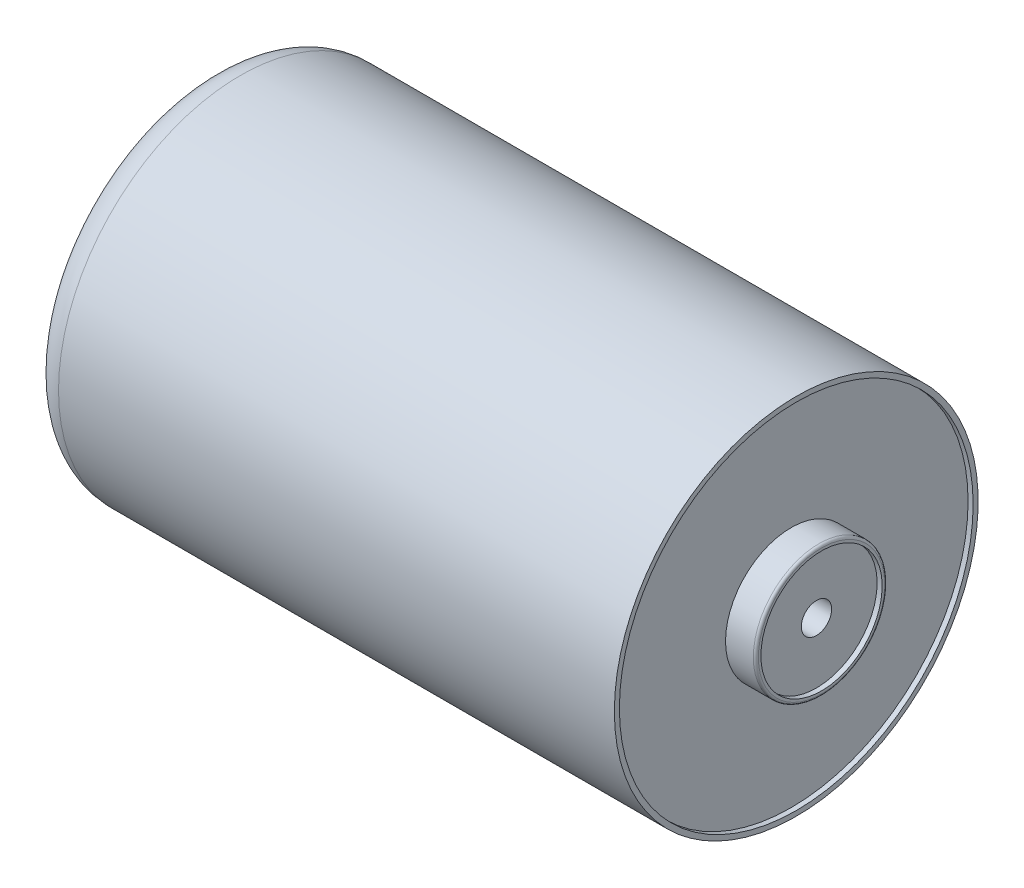
ISO-10303-21;
HEADER;
FILE_DESCRIPTION(('STEP AP214'),'2;1');
FILE_NAME('part.step','',(''),(''),'','','');
FILE_SCHEMA(('AUTOMOTIVE_DESIGN { 1 0 10303 214 1 1 1 1 }'));
ENDSEC;
DATA;
#1=APPLICATION_CONTEXT('core data for automotive mechanical design processes');
#2=APPLICATION_PROTOCOL_DEFINITION('international standard','automotive_design',2000,#1);
#3=PRODUCT_CONTEXT('',#1,'mechanical');
#4=PRODUCT('Part','Part','',(#3));
#5=PRODUCT_RELATED_PRODUCT_CATEGORY('part','',(#4));
#6=PRODUCT_DEFINITION_FORMATION('','',#4);
#7=PRODUCT_DEFINITION_CONTEXT('part definition',#1,'design');
#8=PRODUCT_DEFINITION('design','',#6,#7);
#9=PRODUCT_DEFINITION_SHAPE('','',#8);
#10=(LENGTH_UNIT() NAMED_UNIT(*) SI_UNIT(.MILLI.,.METRE.));
#11=(NAMED_UNIT(*) PLANE_ANGLE_UNIT() SI_UNIT($,.RADIAN.));
#12=(NAMED_UNIT(*) SI_UNIT($,.STERADIAN.) SOLID_ANGLE_UNIT());
#13=UNCERTAINTY_MEASURE_WITH_UNIT(LENGTH_MEASURE(1.E-05),#10,'distance_accuracy_value','');
#14=(GEOMETRIC_REPRESENTATION_CONTEXT(3) GLOBAL_UNCERTAINTY_ASSIGNED_CONTEXT((#13)) GLOBAL_UNIT_ASSIGNED_CONTEXT((#10,
#11,#12)) REPRESENTATION_CONTEXT('',''));
#15=CARTESIAN_POINT('',(0.,0.,0.));
#16=DIRECTION('',(0.,0.,1.));
#17=DIRECTION('',(1.,0.,0.));
#18=AXIS2_PLACEMENT_3D('',#15,#16,#17);
#19=CARTESIAN_POINT('',(0.,0.,0.));
#20=DIRECTION('',(-1.,0.,0.));
#21=DIRECTION('',(0.,0.,1.));
#22=AXIS2_PLACEMENT_3D('',#19,#20,#21);
#23=CYLINDRICAL_SURFACE('',#22,1.49999999999999);
#24=CARTESIAN_POINT('',(70.4735008103728,0.,0.));
#25=DIRECTION('',(-1.,0.,0.));
#26=DIRECTION('',(0.,0.,1.));
#27=AXIS2_PLACEMENT_3D('',#24,#25,#26);
#28=CIRCLE('',#27,1.5);
#29=CARTESIAN_POINT('',(70.4735008103728,0.,1.5));
#30=VERTEX_POINT('',#29);
#31=EDGE_CURVE('E93',#30,#30,#28,.T.);
#32=ORIENTED_EDGE('',*,*,#31,.F.);
#33=EDGE_LOOP('',(#32));
#34=FACE_BOUND('',#33,.T.);
#35=CARTESIAN_POINT('',(6.47350081037276,0.,0.));
#36=DIRECTION('',(-1.,0.,0.));
#37=DIRECTION('',(0.,0.,1.));
#38=AXIS2_PLACEMENT_3D('',#35,#36,#37);
#39=CIRCLE('',#38,1.49999999999999);
#40=CARTESIAN_POINT('',(6.47350081037276,0.,1.49999999999999));
#41=VERTEX_POINT('',#40);
#42=EDGE_CURVE('E66',#41,#41,#39,.T.);
#43=ORIENTED_EDGE('',*,*,#42,.T.);
#44=EDGE_LOOP('',(#43));
#45=FACE_BOUND('',#44,.T.);
#46=ADVANCED_FACE('F35',(#34,#45),#23,.F.);
#47=CARTESIAN_POINT('',(6.47350081037276,1.49999999999999,0.));
#48=DIRECTION('',(1.,0.,0.));
#49=DIRECTION('',(0.,0.,-1.));
#50=AXIS2_PLACEMENT_3D('',#47,#48,#49);
#51=PLANE('',#50);
#52=ORIENTED_EDGE('',*,*,#42,.F.);
#53=EDGE_LOOP('',(#52));
#54=FACE_BOUND('',#53,.T.);
#55=CARTESIAN_POINT('',(6.47350081037276,0.,0.));
#56=DIRECTION('',(-1.,0.,0.));
#57=DIRECTION('',(0.,0.,1.));
#58=AXIS2_PLACEMENT_3D('',#55,#56,#57);
#59=CIRCLE('',#58,6.);
#60=CARTESIAN_POINT('',(6.47350081037276,0.,6.));
#61=VERTEX_POINT('',#60);
#62=EDGE_CURVE('E69',#61,#61,#59,.T.);
#63=ORIENTED_EDGE('',*,*,#62,.T.);
#64=EDGE_LOOP('',(#63));
#65=FACE_BOUND('',#64,.T.);
#66=ADVANCED_FACE('F148',(#54,#65),#51,.F.);
#67=CARTESIAN_POINT('',(0.,0.,0.));
#68=DIRECTION('',(-1.,0.,0.));
#69=DIRECTION('',(0.,0.,1.));
#70=AXIS2_PLACEMENT_3D('',#67,#68,#69);
#71=CYLINDRICAL_SURFACE('',#70,6.);
#72=ORIENTED_EDGE('',*,*,#62,.F.);
#73=EDGE_LOOP('',(#72));
#74=FACE_BOUND('',#73,.T.);
#75=CARTESIAN_POINT('',(5.97350081037276,0.,0.));
#76=DIRECTION('',(-1.,0.,0.));
#77=DIRECTION('',(0.,0.,1.));
#78=AXIS2_PLACEMENT_3D('',#75,#76,#77);
#79=CIRCLE('',#78,6.);
#80=CARTESIAN_POINT('',(5.97350081037276,0.,6.));
#81=VERTEX_POINT('',#80);
#82=EDGE_CURVE('E72',#81,#81,#79,.T.);
#83=ORIENTED_EDGE('',*,*,#82,.T.);
#84=EDGE_LOOP('',(#83));
#85=FACE_BOUND('',#84,.T.);
#86=ADVANCED_FACE('F143',(#74,#85),#71,.F.);
#87=CARTESIAN_POINT('',(5.97350081037276,6.,0.));
#88=DIRECTION('',(1.,0.,0.));
#89=DIRECTION('',(0.,0.,-1.));
#90=AXIS2_PLACEMENT_3D('',#87,#88,#89);
#91=PLANE('',#90);
#92=CARTESIAN_POINT('',(5.97350081037276,0.,0.));
#93=DIRECTION('',(1.,0.,0.));
#94=DIRECTION('',(0.,0.,-1.));
#95=AXIS2_PLACEMENT_3D('',#92,#93,#94);
#96=CIRCLE('',#95,6.25);
#97=CARTESIAN_POINT('',(5.97350081037276,0.,-6.25));
#98=VERTEX_POINT('',#97);
#99=EDGE_CURVE('E45',#98,#98,#96,.F.);
#100=ORIENTED_EDGE('',*,*,#99,.T.);
#101=EDGE_LOOP('',(#100));
#102=FACE_BOUND('',#101,.T.);
#103=ORIENTED_EDGE('',*,*,#82,.F.);
#104=EDGE_LOOP('',(#103));
#105=FACE_BOUND('',#104,.T.);
#106=ADVANCED_FACE('F131',(#102,#105),#91,.F.);
#107=CARTESIAN_POINT('',(0.,0.,0.));
#108=DIRECTION('',(-1.,0.,0.));
#109=DIRECTION('',(0.,0.,1.));
#110=AXIS2_PLACEMENT_3D('',#107,#108,#109);
#111=CYLINDRICAL_SURFACE('',#110,6.5);
#112=CARTESIAN_POINT('',(10.2235008103728,0.,0.));
#113=DIRECTION('',(1.,0.,0.));
#114=DIRECTION('',(0.,0.,-1.));
#115=AXIS2_PLACEMENT_3D('',#112,#113,#114);
#116=CIRCLE('',#115,6.5);
#117=CARTESIAN_POINT('',(10.2235008103728,0.,-6.5));
#118=VERTEX_POINT('',#117);
#119=EDGE_CURVE('E54',#118,#118,#116,.F.);
#120=ORIENTED_EDGE('',*,*,#119,.T.);
#121=EDGE_LOOP('',(#120));
#122=FACE_BOUND('',#121,.T.);
#123=CARTESIAN_POINT('',(6.22350081037276,0.,0.));
#124=DIRECTION('',(1.,0.,0.));
#125=DIRECTION('',(0.,0.,-1.));
#126=AXIS2_PLACEMENT_3D('',#123,#124,#125);
#127=CIRCLE('',#126,6.5);
#128=CARTESIAN_POINT('',(6.22350081037276,0.,-6.5));
#129=VERTEX_POINT('',#128);
#130=EDGE_CURVE('E57',#129,#129,#127,.T.);
#131=ORIENTED_EDGE('',*,*,#130,.T.);
#132=EDGE_LOOP('',(#131));
#133=FACE_BOUND('',#132,.T.);
#134=ADVANCED_FACE('F115',(#122,#133),#111,.T.);
#135=CARTESIAN_POINT('',(10.4735008103728,6.5,0.));
#136=DIRECTION('',(1.,0.,0.));
#137=DIRECTION('',(0.,0.,-1.));
#138=AXIS2_PLACEMENT_3D('',#135,#136,#137);
#139=PLANE('',#138);
#140=CARTESIAN_POINT('',(10.4735008103728,0.,-12.5));
#141=DIRECTION('',(-1.,0.,0.));
#142=DIRECTION('',(0.,0.,-1.));
#143=AXIS2_PLACEMENT_3D('',#140,#141,#142);
#144=CIRCLE('',#143,1.);
#145=CARTESIAN_POINT('',(10.4735008103728,0.,-13.5));
#146=VERTEX_POINT('',#145);
#147=EDGE_CURVE('E105',#146,#146,#144,.T.);
#148=ORIENTED_EDGE('',*,*,#147,.F.);
#149=EDGE_LOOP('',(#148));
#150=FACE_BOUND('',#149,.T.);
#151=CARTESIAN_POINT('',(10.4735008103728,0.,12.5));
#152=DIRECTION('',(-1.,0.,0.));
#153=DIRECTION('',(0.,0.,1.));
#154=AXIS2_PLACEMENT_3D('',#151,#152,#153);
#155=CIRCLE('',#154,1.);
#156=CARTESIAN_POINT('',(10.4735008103728,0.,13.5));
#157=VERTEX_POINT('',#156);
#158=EDGE_CURVE('E99',#157,#157,#155,.T.);
#159=ORIENTED_EDGE('',*,*,#158,.F.);
#160=EDGE_LOOP('',(#159));
#161=FACE_BOUND('',#160,.T.);
#162=CARTESIAN_POINT('',(10.4735008103728,0.,0.));
#163=DIRECTION('',(1.,0.,0.));
#164=DIRECTION('',(0.,0.,-1.));
#165=AXIS2_PLACEMENT_3D('',#162,#163,#164);
#166=CIRCLE('',#165,15.);
#167=CARTESIAN_POINT('',(10.4735008103728,0.,-15.));
#168=VERTEX_POINT('',#167);
#169=EDGE_CURVE('E41',#168,#168,#166,.F.);
#170=ORIENTED_EDGE('',*,*,#169,.T.);
#171=EDGE_LOOP('',(#170));
#172=FACE_BOUND('',#171,.T.);
#173=CARTESIAN_POINT('',(10.4735008103728,0.,0.));
#174=DIRECTION('',(1.,0.,0.));
#175=DIRECTION('',(0.,0.,-1.));
#176=AXIS2_PLACEMENT_3D('',#173,#174,#175);
#177=CIRCLE('',#176,6.75);
#178=CARTESIAN_POINT('',(10.4735008103728,0.,-6.75));
#179=VERTEX_POINT('',#178);
#180=EDGE_CURVE('E49',#179,#179,#177,.T.);
#181=ORIENTED_EDGE('',*,*,#180,.T.);
#182=EDGE_LOOP('',(#181));
#183=FACE_BOUND('',#182,.T.);
#184=ADVANCED_FACE('F111',(#150,#161,#172,#183),#139,.F.);
#185=CARTESIAN_POINT('',(0.,0.,0.));
#186=DIRECTION('',(-1.,0.,0.));
#187=DIRECTION('',(0.,0.,1.));
#188=AXIS2_PLACEMENT_3D('',#185,#186,#187);
#189=CYLINDRICAL_SURFACE('',#188,18.);
#190=CARTESIAN_POINT('',(13.4735008103728,0.,0.));
#191=DIRECTION('',(1.,0.,0.));
#192=DIRECTION('',(0.,0.,-1.));
#193=AXIS2_PLACEMENT_3D('',#190,#191,#192);
#194=CIRCLE('',#193,18.);
#195=CARTESIAN_POINT('',(13.4735008103728,0.,-18.));
#196=VERTEX_POINT('',#195);
#197=EDGE_CURVE('E10',#196,#196,#194,.T.);
#198=ORIENTED_EDGE('',*,*,#197,.T.);
#199=EDGE_LOOP('',(#198));
#200=FACE_BOUND('',#199,.T.);
#201=CARTESIAN_POINT('',(68.4735008103728,0.,0.));
#202=DIRECTION('',(-1.,0.,0.));
#203=DIRECTION('',(0.,0.,1.));
#204=AXIS2_PLACEMENT_3D('',#201,#202,#203);
#205=CIRCLE('',#204,18.);
#206=CARTESIAN_POINT('',(68.4735008103728,0.,18.));
#207=VERTEX_POINT('',#206);
#208=EDGE_CURVE('E75',#207,#207,#205,.T.);
#209=ORIENTED_EDGE('',*,*,#208,.T.);
#210=EDGE_LOOP('',(#209));
#211=FACE_BOUND('',#210,.T.);
#212=ADVANCED_FACE('F114',(#200,#211),#189,.T.);
#213=CARTESIAN_POINT('',(68.4735008103728,18.,0.));
#214=DIRECTION('',(-1.,0.,0.));
#215=DIRECTION('',(0.,0.,1.));
#216=AXIS2_PLACEMENT_3D('',#213,#214,#215);
#217=PLANE('',#216);
#218=ORIENTED_EDGE('',*,*,#208,.F.);
#219=EDGE_LOOP('',(#218));
#220=FACE_BOUND('',#219,.T.);
#221=CARTESIAN_POINT('',(68.4735008103728,0.,0.));
#222=DIRECTION('',(-1.,0.,0.));
#223=DIRECTION('',(0.,0.,1.));
#224=AXIS2_PLACEMENT_3D('',#221,#222,#223);
#225=CIRCLE('',#224,17.5029717240458);
#226=CARTESIAN_POINT('',(68.4735008103728,0.,17.5029717240458));
#227=VERTEX_POINT('',#226);
#228=EDGE_CURVE('E78',#227,#227,#225,.T.);
#229=ORIENTED_EDGE('',*,*,#228,.T.);
#230=EDGE_LOOP('',(#229));
#231=FACE_BOUND('',#230,.T.);
#232=ADVANCED_FACE('F195',(#220,#231),#217,.F.);
#233=CARTESIAN_POINT('',(0.,0.,0.));
#234=DIRECTION('',(-1.,0.,0.));
#235=DIRECTION('',(0.,0.,1.));
#236=AXIS2_PLACEMENT_3D('',#233,#234,#235);
#237=CYLINDRICAL_SURFACE('',#236,17.5029717240458);
#238=ORIENTED_EDGE('',*,*,#228,.F.);
#239=EDGE_LOOP('',(#238));
#240=FACE_BOUND('',#239,.T.);
#241=CARTESIAN_POINT('',(67.9735008103728,0.,0.));
#242=DIRECTION('',(-1.,0.,0.));
#243=DIRECTION('',(0.,0.,1.));
#244=AXIS2_PLACEMENT_3D('',#241,#242,#243);
#245=CIRCLE('',#244,17.5029717240458);
#246=CARTESIAN_POINT('',(67.9735008103728,0.,17.5029717240458));
#247=VERTEX_POINT('',#246);
#248=EDGE_CURVE('E81',#247,#247,#245,.T.);
#249=ORIENTED_EDGE('',*,*,#248,.T.);
#250=EDGE_LOOP('',(#249));
#251=FACE_BOUND('',#250,.T.);
#252=ADVANCED_FACE('F191',(#240,#251),#237,.F.);
#253=CARTESIAN_POINT('',(67.9735008103728,17.5029717240458,0.));
#254=DIRECTION('',(-1.,0.,0.));
#255=DIRECTION('',(0.,0.,1.));
#256=AXIS2_PLACEMENT_3D('',#253,#254,#255);
#257=PLANE('',#256);
#258=ORIENTED_EDGE('',*,*,#248,.F.);
#259=EDGE_LOOP('',(#258));
#260=FACE_BOUND('',#259,.T.);
#261=CARTESIAN_POINT('',(67.9735008103728,0.,0.));
#262=DIRECTION('',(-1.,0.,0.));
#263=DIRECTION('',(0.,0.,1.));
#264=AXIS2_PLACEMENT_3D('',#261,#262,#263);
#265=CIRCLE('',#264,6.5);
#266=CARTESIAN_POINT('',(67.9735008103728,0.,6.5));
#267=VERTEX_POINT('',#266);
#268=EDGE_CURVE('E84',#267,#267,#265,.T.);
#269=ORIENTED_EDGE('',*,*,#268,.T.);
#270=EDGE_LOOP('',(#269));
#271=FACE_BOUND('',#270,.T.);
#272=ADVANCED_FACE('F187',(#260,#271),#257,.F.);
#273=CARTESIAN_POINT('',(0.,0.,0.));
#274=DIRECTION('',(-1.,0.,0.));
#275=DIRECTION('',(0.,0.,1.));
#276=AXIS2_PLACEMENT_3D('',#273,#274,#275);
#277=CYLINDRICAL_SURFACE('',#276,6.5);
#278=CARTESIAN_POINT('',(70.7235008103728,0.,0.));
#279=DIRECTION('',(-1.,0.,0.));
#280=DIRECTION('',(0.,0.,1.));
#281=AXIS2_PLACEMENT_3D('',#278,#279,#280);
#282=CIRCLE('',#281,6.5);
#283=CARTESIAN_POINT('',(70.7235008103728,0.,6.5));
#284=VERTEX_POINT('',#283);
#285=EDGE_CURVE('E63',#284,#284,#282,.T.);
#286=ORIENTED_EDGE('',*,*,#285,.T.);
#287=EDGE_LOOP('',(#286));
#288=FACE_BOUND('',#287,.T.);
#289=ORIENTED_EDGE('',*,*,#268,.F.);
#290=EDGE_LOOP('',(#289));
#291=FACE_BOUND('',#290,.T.);
#292=ADVANCED_FACE('F183',(#288,#291),#277,.T.);
#293=CARTESIAN_POINT('',(70.9735008103728,6.5,0.));
#294=DIRECTION('',(-1.,0.,0.));
#295=DIRECTION('',(0.,0.,1.));
#296=AXIS2_PLACEMENT_3D('',#293,#294,#295);
#297=PLANE('',#296);
#298=CARTESIAN_POINT('',(70.9735008103728,0.,0.));
#299=DIRECTION('',(-1.,0.,0.));
#300=DIRECTION('',(0.,0.,1.));
#301=AXIS2_PLACEMENT_3D('',#298,#299,#300);
#302=CIRCLE('',#301,6.25);
#303=CARTESIAN_POINT('',(70.9735008103728,0.,6.25));
#304=VERTEX_POINT('',#303);
#305=EDGE_CURVE('E60',#304,#304,#302,.F.);
#306=ORIENTED_EDGE('',*,*,#305,.T.);
#307=EDGE_LOOP('',(#306));
#308=FACE_BOUND('',#307,.T.);
#309=CARTESIAN_POINT('',(70.9735008103728,0.,0.));
#310=DIRECTION('',(-1.,0.,0.));
#311=DIRECTION('',(0.,0.,1.));
#312=AXIS2_PLACEMENT_3D('',#309,#310,#311);
#313=CIRCLE('',#312,6.);
#314=CARTESIAN_POINT('',(70.9735008103728,0.,6.));
#315=VERTEX_POINT('',#314);
#316=EDGE_CURVE('E87',#315,#315,#313,.T.);
#317=ORIENTED_EDGE('',*,*,#316,.T.);
#318=EDGE_LOOP('',(#317));
#319=FACE_BOUND('',#318,.T.);
#320=ADVANCED_FACE('F176',(#308,#319),#297,.F.);
#321=CARTESIAN_POINT('',(0.,0.,0.));
#322=DIRECTION('',(-1.,0.,0.));
#323=DIRECTION('',(0.,0.,1.));
#324=AXIS2_PLACEMENT_3D('',#321,#322,#323);
#325=CYLINDRICAL_SURFACE('',#324,6.);
#326=ORIENTED_EDGE('',*,*,#316,.F.);
#327=EDGE_LOOP('',(#326));
#328=FACE_BOUND('',#327,.T.);
#329=CARTESIAN_POINT('',(70.4735008103728,0.,0.));
#330=DIRECTION('',(-1.,0.,0.));
#331=DIRECTION('',(0.,0.,1.));
#332=AXIS2_PLACEMENT_3D('',#329,#330,#331);
#333=CIRCLE('',#332,6.);
#334=CARTESIAN_POINT('',(70.4735008103728,0.,6.));
#335=VERTEX_POINT('',#334);
#336=EDGE_CURVE('E90',#335,#335,#333,.T.);
#337=ORIENTED_EDGE('',*,*,#336,.T.);
#338=EDGE_LOOP('',(#337));
#339=FACE_BOUND('',#338,.T.);
#340=ADVANCED_FACE('F167',(#328,#339),#325,.F.);
#341=CARTESIAN_POINT('',(70.4735008103728,6.,0.));
#342=DIRECTION('',(-1.,0.,0.));
#343=DIRECTION('',(0.,0.,1.));
#344=AXIS2_PLACEMENT_3D('',#341,#342,#343);
#345=PLANE('',#344);
#346=ORIENTED_EDGE('',*,*,#336,.F.);
#347=EDGE_LOOP('',(#346));
#348=FACE_BOUND('',#347,.T.);
#349=ORIENTED_EDGE('',*,*,#31,.T.);
#350=EDGE_LOOP('',(#349));
#351=FACE_BOUND('',#350,.T.);
#352=ADVANCED_FACE('F165',(#348,#351),#345,.F.);
#353=CARTESIAN_POINT('',(70.7235008103728,0.,0.));
#354=DIRECTION('',(-1.,0.,0.));
#355=DIRECTION('',(0.,0.,1.));
#356=AXIS2_PLACEMENT_3D('',#353,#354,#355);
#357=TOROIDAL_SURFACE('',#356,6.25,0.25);
#358=ORIENTED_EDGE('',*,*,#305,.F.);
#359=EDGE_LOOP('',(#358));
#360=FACE_BOUND('',#359,.T.);
#361=ORIENTED_EDGE('',*,*,#285,.F.);
#362=EDGE_LOOP('',(#361));
#363=FACE_BOUND('',#362,.T.);
#364=ADVANCED_FACE('F125',(#360,#363),#357,.T.);
#365=CARTESIAN_POINT('',(10.2235008103728,0.,0.));
#366=DIRECTION('',(1.,0.,0.));
#367=DIRECTION('',(0.,0.,-1.));
#368=AXIS2_PLACEMENT_3D('',#365,#366,#367);
#369=TOROIDAL_SURFACE('',#368,6.75,0.25);
#370=ORIENTED_EDGE('',*,*,#180,.F.);
#371=EDGE_LOOP('',(#370));
#372=FACE_BOUND('',#371,.T.);
#373=ORIENTED_EDGE('',*,*,#119,.F.);
#374=EDGE_LOOP('',(#373));
#375=FACE_BOUND('',#374,.T.);
#376=ADVANCED_FACE('F121',(#372,#375),#369,.F.);
#377=CARTESIAN_POINT('',(6.22350081037276,0.,0.));
#378=DIRECTION('',(1.,0.,0.));
#379=DIRECTION('',(0.,0.,-1.));
#380=AXIS2_PLACEMENT_3D('',#377,#378,#379);
#381=TOROIDAL_SURFACE('',#380,6.25,0.25);
#382=ORIENTED_EDGE('',*,*,#130,.F.);
#383=EDGE_LOOP('',(#382));
#384=FACE_BOUND('',#383,.T.);
#385=ORIENTED_EDGE('',*,*,#99,.F.);
#386=EDGE_LOOP('',(#385));
#387=FACE_BOUND('',#386,.T.);
#388=ADVANCED_FACE('F124',(#384,#387),#381,.T.);
#389=CARTESIAN_POINT('',(13.4735008103728,0.,0.));
#390=DIRECTION('',(1.,0.,0.));
#391=DIRECTION('',(0.,0.,-1.));
#392=AXIS2_PLACEMENT_3D('',#389,#390,#391);
#393=TOROIDAL_SURFACE('',#392,15.,3.);
#394=ORIENTED_EDGE('',*,*,#197,.F.);
#395=EDGE_LOOP('',(#394));
#396=FACE_BOUND('',#395,.T.);
#397=ORIENTED_EDGE('',*,*,#169,.F.);
#398=EDGE_LOOP('',(#397));
#399=FACE_BOUND('',#398,.T.);
#400=ADVANCED_FACE('F137',(#396,#399),#393,.T.);
#401=CARTESIAN_POINT('',(20.4735008103728,0.,12.5));
#402=DIRECTION('',(-1.,0.,0.));
#403=DIRECTION('',(0.,0.,1.));
#404=AXIS2_PLACEMENT_3D('',#401,#402,#403);
#405=CYLINDRICAL_SURFACE('',#404,1.);
#406=CARTESIAN_POINT('',(20.4735008103728,0.,12.5));
#407=DIRECTION('',(-1.,0.,0.));
#408=DIRECTION('',(0.,0.,1.));
#409=AXIS2_PLACEMENT_3D('',#406,#407,#408);
#410=CIRCLE('',#409,1.);
#411=CARTESIAN_POINT('',(20.4735008103728,0.,13.5));
#412=VERTEX_POINT('',#411);
#413=EDGE_CURVE('E96',#412,#412,#410,.T.);
#414=ORIENTED_EDGE('',*,*,#413,.F.);
#415=EDGE_LOOP('',(#414));
#416=FACE_BOUND('',#415,.T.);
#417=ORIENTED_EDGE('',*,*,#158,.T.);
#418=EDGE_LOOP('',(#417));
#419=FACE_BOUND('',#418,.T.);
#420=ADVANCED_FACE('F267',(#416,#419),#405,.F.);
#421=CARTESIAN_POINT('',(20.4735008103728,0.,12.5));
#422=DIRECTION('',(-1.,0.,0.));
#423=DIRECTION('',(0.,0.,1.));
#424=AXIS2_PLACEMENT_3D('',#421,#422,#423);
#425=PLANE('',#424);
#426=ORIENTED_EDGE('',*,*,#413,.T.);
#427=EDGE_LOOP('',(#426));
#428=FACE_BOUND('',#427,.T.);
#429=ADVANCED_FACE('F275',(#428),#425,.T.);
#430=CARTESIAN_POINT('',(20.4735008103728,0.,-12.5));
#431=DIRECTION('',(-1.,0.,0.));
#432=DIRECTION('',(0.,0.,1.));
#433=AXIS2_PLACEMENT_3D('',#430,#431,#432);
#434=CYLINDRICAL_SURFACE('',#433,1.);
#435=CARTESIAN_POINT('',(20.4735008103728,0.,-12.5));
#436=DIRECTION('',(-1.,0.,0.));
#437=DIRECTION('',(0.,0.,-1.));
#438=AXIS2_PLACEMENT_3D('',#435,#436,#437);
#439=CIRCLE('',#438,1.);
#440=CARTESIAN_POINT('',(20.4735008103728,0.,-13.5));
#441=VERTEX_POINT('',#440);
#442=EDGE_CURVE('E102',#441,#441,#439,.T.);
#443=ORIENTED_EDGE('',*,*,#442,.F.);
#444=EDGE_LOOP('',(#443));
#445=FACE_BOUND('',#444,.T.);
#446=ORIENTED_EDGE('',*,*,#147,.T.);
#447=EDGE_LOOP('',(#446));
#448=FACE_BOUND('',#447,.T.);
#449=ADVANCED_FACE('F109',(#445,#448),#434,.F.);
#450=CARTESIAN_POINT('',(20.4735008103728,0.,-12.5));
#451=DIRECTION('',(1.,0.,0.));
#452=DIRECTION('',(0.,0.,-1.));
#453=AXIS2_PLACEMENT_3D('',#450,#451,#452);
#454=PLANE('',#453);
#455=ORIENTED_EDGE('',*,*,#442,.T.);
#456=EDGE_LOOP('',(#455));
#457=FACE_BOUND('',#456,.T.);
#458=ADVANCED_FACE('F290',(#457),#454,.F.);
#459=CLOSED_SHELL('',(#46,#66,#86,#106,#134,#184,#212,#232,#252,#272,#292,#320,#340,#352,#364,
#376,#388,#400,#420,#429,#449,#458));
#460=MANIFOLD_SOLID_BREP('B2',#459);
#461=ADVANCED_BREP_SHAPE_REPRESENTATION('',(#18,#460),#14);
#462=SHAPE_DEFINITION_REPRESENTATION(#9,#461);
ENDSEC;
END-ISO-10303-21;
